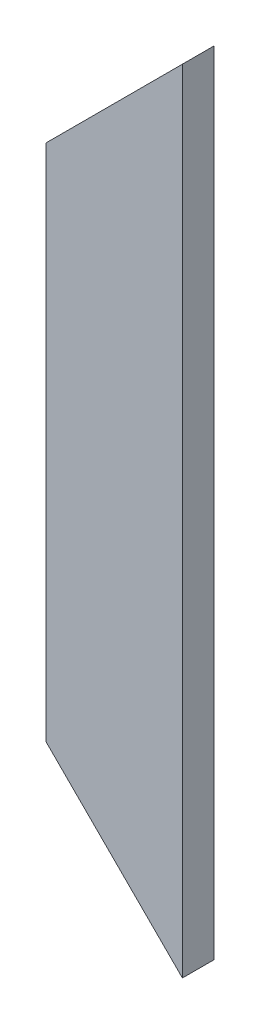
ISO-10303-21;
HEADER;
FILE_DESCRIPTION(('STEP AP214'),'2;1');
FILE_NAME('part.step','',(''),(''),'','','');
FILE_SCHEMA(('AUTOMOTIVE_DESIGN { 1 0 10303 214 1 1 1 1 }'));
ENDSEC;
DATA;
#1=APPLICATION_CONTEXT('core data for automotive mechanical design processes');
#2=APPLICATION_PROTOCOL_DEFINITION('international standard','automotive_design',2000,#1);
#3=PRODUCT_CONTEXT('',#1,'mechanical');
#4=PRODUCT('Part','Part','',(#3));
#5=PRODUCT_RELATED_PRODUCT_CATEGORY('part','',(#4));
#6=PRODUCT_DEFINITION_FORMATION('','',#4);
#7=PRODUCT_DEFINITION_CONTEXT('part definition',#1,'design');
#8=PRODUCT_DEFINITION('design','',#6,#7);
#9=PRODUCT_DEFINITION_SHAPE('','',#8);
#10=(LENGTH_UNIT() NAMED_UNIT(*) SI_UNIT(.MILLI.,.METRE.));
#11=(NAMED_UNIT(*) PLANE_ANGLE_UNIT() SI_UNIT($,.RADIAN.));
#12=(NAMED_UNIT(*) SI_UNIT($,.STERADIAN.) SOLID_ANGLE_UNIT());
#13=UNCERTAINTY_MEASURE_WITH_UNIT(LENGTH_MEASURE(1.E-05),#10,'distance_accuracy_value','');
#14=(GEOMETRIC_REPRESENTATION_CONTEXT(3) GLOBAL_UNCERTAINTY_ASSIGNED_CONTEXT((#13)) GLOBAL_UNIT_ASSIGNED_CONTEXT((#10,
#11,#12)) REPRESENTATION_CONTEXT('',''));
#15=CARTESIAN_POINT('',(0.,0.,0.));
#16=DIRECTION('',(0.,0.,1.));
#17=DIRECTION('',(1.,0.,0.));
#18=AXIS2_PLACEMENT_3D('',#15,#16,#17);
#19=CARTESIAN_POINT('',(-13.,0.,3.));
#20=DIRECTION('',(-1.,0.,0.));
#21=DIRECTION('',(0.,0.,1.));
#22=AXIS2_PLACEMENT_3D('',#19,#20,#21);
#23=PLANE('',#22);
#24=DIRECTION('',(0.,1.,0.));
#25=VECTOR('',#24,1.);
#26=CARTESIAN_POINT('',(-13.,0.,0.));
#27=LINE('',#26,#25);
#28=CARTESIAN_POINT('',(-13.,-24.75,0.));
#29=VERTEX_POINT('',#28);
#30=CARTESIAN_POINT('',(-13.,24.75,0.));
#31=VERTEX_POINT('',#30);
#32=EDGE_CURVE('E102',#29,#31,#27,.T.);
#33=ORIENTED_EDGE('',*,*,#32,.F.);
#34=DIRECTION('',(0.,0.,-1.));
#35=VECTOR('',#34,1.);
#36=CARTESIAN_POINT('',(-13.,-24.75,3.));
#37=LINE('',#36,#35);
#38=CARTESIAN_POINT('',(-13.,-24.75,3.));
#39=VERTEX_POINT('',#38);
#40=EDGE_CURVE('E11',#39,#29,#37,.T.);
#41=ORIENTED_EDGE('',*,*,#40,.F.);
#42=DIRECTION('',(0.,1.,0.));
#43=VECTOR('',#42,1.);
#44=CARTESIAN_POINT('',(-13.,0.,3.));
#45=LINE('',#44,#43);
#46=CARTESIAN_POINT('',(-13.,24.75,3.));
#47=VERTEX_POINT('',#46);
#48=EDGE_CURVE('E87',#39,#47,#45,.T.);
#49=ORIENTED_EDGE('',*,*,#48,.T.);
#50=DIRECTION('',(0.,0.,-1.));
#51=VECTOR('',#50,1.);
#52=CARTESIAN_POINT('',(-13.,24.75,3.));
#53=LINE('',#52,#51);
#54=EDGE_CURVE('E55',#47,#31,#53,.T.);
#55=ORIENTED_EDGE('',*,*,#54,.T.);
#56=EDGE_LOOP('',(#33,#41,#49,#55));
#57=FACE_BOUND('',#56,.T.);
#58=ADVANCED_FACE('F39',(#57),#23,.T.);
#59=CARTESIAN_POINT('',(-18.8750000000001,-18.8749999999999,3.));
#60=DIRECTION('',(0.707106781186552,0.707106781186543,0.));
#61=DIRECTION('',(-0.707106781186543,0.707106781186552,0.));
#62=AXIS2_PLACEMENT_3D('',#59,#60,#61);
#63=PLANE('',#62);
#64=DIRECTION('',(0.707106781186543,-0.707106781186552,0.));
#65=VECTOR('',#64,1.);
#66=CARTESIAN_POINT('',(-18.8750000000001,-18.8749999999999,0.));
#67=LINE('',#66,#65);
#68=CARTESIAN_POINT('',(0.,-37.7500000000002,0.));
#69=VERTEX_POINT('',#68);
#70=EDGE_CURVE('E93',#29,#69,#67,.T.);
#71=ORIENTED_EDGE('',*,*,#70,.T.);
#72=DIRECTION('',(0.,0.,-1.));
#73=VECTOR('',#72,1.);
#74=CARTESIAN_POINT('',(0.,-37.7500000000002,3.));
#75=LINE('',#74,#73);
#76=CARTESIAN_POINT('',(0.,-37.7500000000002,3.));
#77=VERTEX_POINT('',#76);
#78=EDGE_CURVE('E47',#77,#69,#75,.T.);
#79=ORIENTED_EDGE('',*,*,#78,.F.);
#80=DIRECTION('',(0.707106781186543,-0.707106781186552,0.));
#81=VECTOR('',#80,1.);
#82=CARTESIAN_POINT('',(-18.8750000000001,-18.8749999999999,3.));
#83=LINE('',#82,#81);
#84=EDGE_CURVE('E81',#39,#77,#83,.T.);
#85=ORIENTED_EDGE('',*,*,#84,.F.);
#86=ORIENTED_EDGE('',*,*,#40,.T.);
#87=EDGE_LOOP('',(#71,#79,#85,#86));
#88=FACE_BOUND('',#87,.T.);
#89=ADVANCED_FACE('F91',(#88),#63,.F.);
#90=CARTESIAN_POINT('',(0.,0.,3.));
#91=DIRECTION('',(1.,0.,0.));
#92=DIRECTION('',(0.,0.,-1.));
#93=AXIS2_PLACEMENT_3D('',#90,#91,#92);
#94=PLANE('',#93);
#95=DIRECTION('',(0.,-1.,0.));
#96=VECTOR('',#95,1.);
#97=CARTESIAN_POINT('',(0.,0.,0.));
#98=LINE('',#97,#96);
#99=CARTESIAN_POINT('',(0.,37.7500000000002,0.));
#100=VERTEX_POINT('',#99);
#101=EDGE_CURVE('E105',#100,#69,#98,.T.);
#102=ORIENTED_EDGE('',*,*,#101,.F.);
#103=DIRECTION('',(0.,0.,-1.));
#104=VECTOR('',#103,1.);
#105=CARTESIAN_POINT('',(0.,37.7500000000002,3.));
#106=LINE('',#105,#104);
#107=CARTESIAN_POINT('',(0.,37.7500000000002,3.));
#108=VERTEX_POINT('',#107);
#109=EDGE_CURVE('E68',#108,#100,#106,.T.);
#110=ORIENTED_EDGE('',*,*,#109,.F.);
#111=DIRECTION('',(0.,-1.,0.));
#112=VECTOR('',#111,1.);
#113=CARTESIAN_POINT('',(0.,0.,3.));
#114=LINE('',#113,#112);
#115=EDGE_CURVE('E86',#108,#77,#114,.T.);
#116=ORIENTED_EDGE('',*,*,#115,.T.);
#117=ORIENTED_EDGE('',*,*,#78,.T.);
#118=EDGE_LOOP('',(#102,#110,#116,#117));
#119=FACE_BOUND('',#118,.T.);
#120=ADVANCED_FACE('F96',(#119),#94,.T.);
#121=CARTESIAN_POINT('',(-18.8750000000001,18.8749999999999,3.));
#122=DIRECTION('',(-0.707106781186552,0.707106781186543,0.));
#123=DIRECTION('',(-0.707106781186543,-0.707106781186552,0.));
#124=AXIS2_PLACEMENT_3D('',#121,#122,#123);
#125=PLANE('',#124);
#126=DIRECTION('',(0.707106781186543,0.707106781186552,0.));
#127=VECTOR('',#126,1.);
#128=CARTESIAN_POINT('',(-18.8750000000001,18.8749999999999,0.));
#129=LINE('',#128,#127);
#130=EDGE_CURVE('E107',#31,#100,#129,.T.);
#131=ORIENTED_EDGE('',*,*,#130,.F.);
#132=ORIENTED_EDGE('',*,*,#54,.F.);
#133=DIRECTION('',(0.707106781186543,0.707106781186552,0.));
#134=VECTOR('',#133,1.);
#135=CARTESIAN_POINT('',(-18.8750000000001,18.8749999999999,3.));
#136=LINE('',#135,#134);
#137=EDGE_CURVE('E97',#47,#108,#136,.T.);
#138=ORIENTED_EDGE('',*,*,#137,.T.);
#139=ORIENTED_EDGE('',*,*,#109,.T.);
#140=EDGE_LOOP('',(#131,#132,#138,#139));
#141=FACE_BOUND('',#140,.T.);
#142=ADVANCED_FACE('F112',(#141),#125,.T.);
#143=CARTESIAN_POINT('',(0.,0.,3.));
#144=DIRECTION('',(0.,0.,1.));
#145=DIRECTION('',(1.,0.,0.));
#146=AXIS2_PLACEMENT_3D('',#143,#144,#145);
#147=PLANE('',#146);
#148=ORIENTED_EDGE('',*,*,#48,.F.);
#149=ORIENTED_EDGE('',*,*,#84,.T.);
#150=ORIENTED_EDGE('',*,*,#115,.F.);
#151=ORIENTED_EDGE('',*,*,#137,.F.);
#152=EDGE_LOOP('',(#148,#149,#150,#151));
#153=FACE_BOUND('',#152,.T.);
#154=ADVANCED_FACE('F83',(#153),#147,.T.);
#155=CARTESIAN_POINT('',(0.,0.,0.));
#156=DIRECTION('',(0.,0.,1.));
#157=DIRECTION('',(1.,0.,0.));
#158=AXIS2_PLACEMENT_3D('',#155,#156,#157);
#159=PLANE('',#158);
#160=ORIENTED_EDGE('',*,*,#32,.T.);
#161=ORIENTED_EDGE('',*,*,#130,.T.);
#162=ORIENTED_EDGE('',*,*,#101,.T.);
#163=ORIENTED_EDGE('',*,*,#70,.F.);
#164=EDGE_LOOP('',(#160,#161,#162,#163));
#165=FACE_BOUND('',#164,.T.);
#166=ADVANCED_FACE('F119',(#165),#159,.F.);
#167=CLOSED_SHELL('',(#58,#89,#120,#142,#154,#166));
#168=MANIFOLD_SOLID_BREP('B2',#167);
#169=ADVANCED_BREP_SHAPE_REPRESENTATION('',(#18,#168),#14);
#170=SHAPE_DEFINITION_REPRESENTATION(#9,#169);
ENDSEC;
END-ISO-10303-21;
